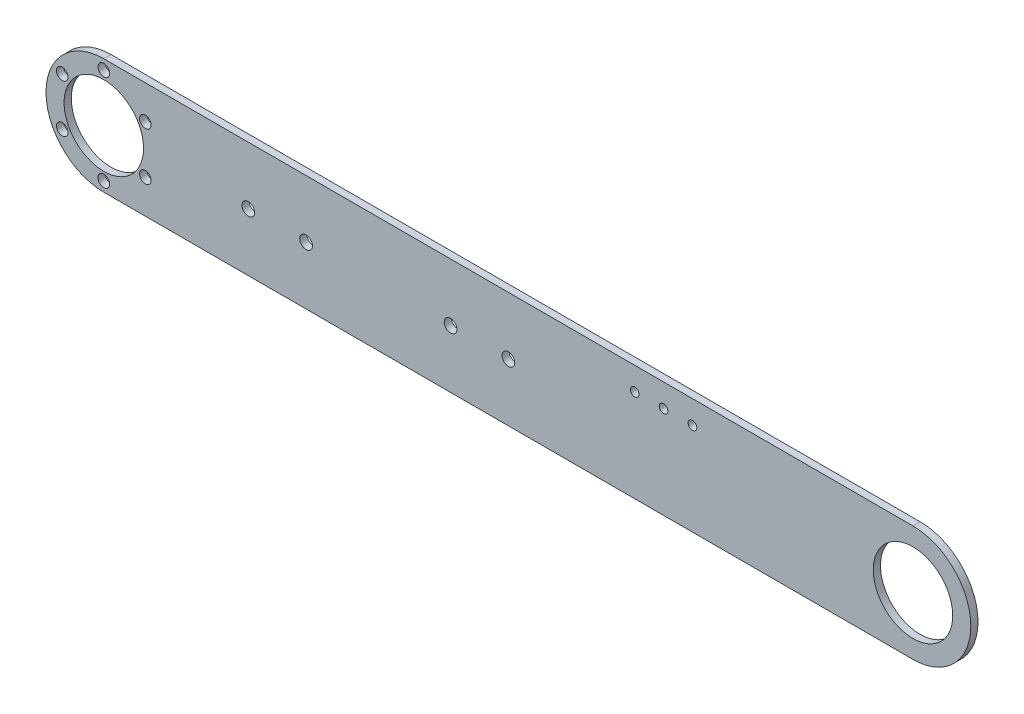
ISO-10303-21;
HEADER;
FILE_DESCRIPTION(('STEP AP214'),'2;1');
FILE_NAME('part.step','',(''),(''),'','','');
FILE_SCHEMA(('AUTOMOTIVE_DESIGN { 1 0 10303 214 1 1 1 1 }'));
ENDSEC;
DATA;
#1=APPLICATION_CONTEXT('core data for automotive mechanical design processes');
#2=APPLICATION_PROTOCOL_DEFINITION('international standard','automotive_design',2000,#1);
#3=PRODUCT_CONTEXT('',#1,'mechanical');
#4=PRODUCT('Part','Part','',(#3));
#5=PRODUCT_RELATED_PRODUCT_CATEGORY('part','',(#4));
#6=PRODUCT_DEFINITION_FORMATION('','',#4);
#7=PRODUCT_DEFINITION_CONTEXT('part definition',#1,'design');
#8=PRODUCT_DEFINITION('design','',#6,#7);
#9=PRODUCT_DEFINITION_SHAPE('','',#8);
#10=(LENGTH_UNIT() NAMED_UNIT(*) SI_UNIT(.MILLI.,.METRE.));
#11=(NAMED_UNIT(*) PLANE_ANGLE_UNIT() SI_UNIT($,.RADIAN.));
#12=(NAMED_UNIT(*) SI_UNIT($,.STERADIAN.) SOLID_ANGLE_UNIT());
#13=UNCERTAINTY_MEASURE_WITH_UNIT(LENGTH_MEASURE(1.E-05),#10,'distance_accuracy_value','');
#14=(GEOMETRIC_REPRESENTATION_CONTEXT(3) GLOBAL_UNCERTAINTY_ASSIGNED_CONTEXT((#13)) GLOBAL_UNIT_ASSIGNED_CONTEXT((#10,
#11,#12)) REPRESENTATION_CONTEXT('',''));
#15=CARTESIAN_POINT('',(0.,0.,0.));
#16=DIRECTION('',(0.,0.,1.));
#17=DIRECTION('',(1.,0.,0.));
#18=AXIS2_PLACEMENT_3D('',#15,#16,#17);
#19=CARTESIAN_POINT('',(0.,25.4,3.175));
#20=DIRECTION('',(0.,0.,-1.));
#21=DIRECTION('',(-1.,0.,0.));
#22=AXIS2_PLACEMENT_3D('',#19,#20,#21);
#23=CYLINDRICAL_SURFACE('',#22,25.4);
#24=CARTESIAN_POINT('',(0.,25.4,0.));
#25=DIRECTION('',(0.,0.,1.));
#26=DIRECTION('',(1.,0.,0.));
#27=AXIS2_PLACEMENT_3D('',#24,#25,#26);
#28=CIRCLE('',#27,25.4);
#29=CARTESIAN_POINT('',(0.,50.8,0.));
#30=VERTEX_POINT('',#29);
#31=CARTESIAN_POINT('',(0.,0.,0.));
#32=VERTEX_POINT('',#31);
#33=EDGE_CURVE('E98',#30,#32,#28,.T.);
#34=ORIENTED_EDGE('',*,*,#33,.T.);
#35=DIRECTION('',(0.,0.,-1.));
#36=VECTOR('',#35,1.);
#37=CARTESIAN_POINT('',(0.,0.,3.175));
#38=LINE('',#37,#36);
#39=CARTESIAN_POINT('',(0.,0.,3.175));
#40=VERTEX_POINT('',#39);
#41=EDGE_CURVE('E11',#40,#32,#38,.T.);
#42=ORIENTED_EDGE('',*,*,#41,.F.);
#43=CARTESIAN_POINT('',(0.,25.4,3.175));
#44=DIRECTION('',(0.,0.,1.));
#45=DIRECTION('',(1.,0.,0.));
#46=AXIS2_PLACEMENT_3D('',#43,#44,#45);
#47=CIRCLE('',#46,25.4);
#48=CARTESIAN_POINT('',(0.,50.8,3.175));
#49=VERTEX_POINT('',#48);
#50=EDGE_CURVE('E86',#49,#40,#47,.T.);
#51=ORIENTED_EDGE('',*,*,#50,.F.);
#52=DIRECTION('',(0.,0.,-1.));
#53=VECTOR('',#52,1.);
#54=CARTESIAN_POINT('',(0.,50.8,3.175));
#55=LINE('',#54,#53);
#56=EDGE_CURVE('E94',#49,#30,#55,.T.);
#57=ORIENTED_EDGE('',*,*,#56,.T.);
#58=EDGE_LOOP('',(#34,#42,#51,#57));
#59=FACE_BOUND('',#58,.T.);
#60=ADVANCED_FACE('F35',(#59),#23,.T.);
#61=CARTESIAN_POINT('',(0.,0.,3.175));
#62=DIRECTION('',(0.,1.,0.));
#63=DIRECTION('',(0.,0.,1.));
#64=AXIS2_PLACEMENT_3D('',#61,#62,#63);
#65=PLANE('',#64);
#66=DIRECTION('',(1.,0.,0.));
#67=VECTOR('',#66,1.);
#68=CARTESIAN_POINT('',(0.,0.,0.));
#69=LINE('',#68,#67);
#70=CARTESIAN_POINT('',(355.6,0.,0.));
#71=VERTEX_POINT('',#70);
#72=EDGE_CURVE('E90',#32,#71,#69,.T.);
#73=ORIENTED_EDGE('',*,*,#72,.T.);
#74=DIRECTION('',(0.,0.,-1.));
#75=VECTOR('',#74,1.);
#76=CARTESIAN_POINT('',(355.6,0.,3.175));
#77=LINE('',#76,#75);
#78=CARTESIAN_POINT('',(355.6,0.,3.175));
#79=VERTEX_POINT('',#78);
#80=EDGE_CURVE('E43',#79,#71,#77,.T.);
#81=ORIENTED_EDGE('',*,*,#80,.F.);
#82=DIRECTION('',(1.,0.,0.));
#83=VECTOR('',#82,1.);
#84=CARTESIAN_POINT('',(0.,0.,3.175));
#85=LINE('',#84,#83);
#86=EDGE_CURVE('E81',#40,#79,#85,.T.);
#87=ORIENTED_EDGE('',*,*,#86,.F.);
#88=ORIENTED_EDGE('',*,*,#41,.T.);
#89=EDGE_LOOP('',(#73,#81,#87,#88));
#90=FACE_BOUND('',#89,.T.);
#91=ADVANCED_FACE('F89',(#90),#65,.F.);
#92=CARTESIAN_POINT('',(355.6,25.4,3.175));
#93=DIRECTION('',(0.,0.,-1.));
#94=DIRECTION('',(-1.,0.,0.));
#95=AXIS2_PLACEMENT_3D('',#92,#93,#94);
#96=CYLINDRICAL_SURFACE('',#95,25.4);
#97=CARTESIAN_POINT('',(355.6,25.4,0.));
#98=DIRECTION('',(0.,0.,1.));
#99=DIRECTION('',(1.,0.,0.));
#100=AXIS2_PLACEMENT_3D('',#97,#98,#99);
#101=CIRCLE('',#100,25.4);
#102=CARTESIAN_POINT('',(355.6,50.8,0.));
#103=VERTEX_POINT('',#102);
#104=EDGE_CURVE('E68',#71,#103,#101,.T.);
#105=ORIENTED_EDGE('',*,*,#104,.T.);
#106=DIRECTION('',(0.,0.,-1.));
#107=VECTOR('',#106,1.);
#108=CARTESIAN_POINT('',(355.6,50.8,3.175));
#109=LINE('',#108,#107);
#110=CARTESIAN_POINT('',(355.6,50.8,3.175));
#111=VERTEX_POINT('',#110);
#112=EDGE_CURVE('E91',#111,#103,#109,.T.);
#113=ORIENTED_EDGE('',*,*,#112,.F.);
#114=CARTESIAN_POINT('',(355.6,25.4,3.175));
#115=DIRECTION('',(0.,0.,1.));
#116=DIRECTION('',(1.,0.,0.));
#117=AXIS2_PLACEMENT_3D('',#114,#115,#116);
#118=CIRCLE('',#117,25.4);
#119=EDGE_CURVE('E84',#79,#111,#118,.T.);
#120=ORIENTED_EDGE('',*,*,#119,.F.);
#121=ORIENTED_EDGE('',*,*,#80,.T.);
#122=EDGE_LOOP('',(#105,#113,#120,#121));
#123=FACE_BOUND('',#122,.T.);
#124=ADVANCED_FACE('F92',(#123),#96,.T.);
#125=CARTESIAN_POINT('',(0.,50.8,3.175));
#126=DIRECTION('',(0.,-1.,0.));
#127=DIRECTION('',(0.,0.,-1.));
#128=AXIS2_PLACEMENT_3D('',#125,#126,#127);
#129=PLANE('',#128);
#130=DIRECTION('',(-1.,0.,0.));
#131=VECTOR('',#130,1.);
#132=CARTESIAN_POINT('',(0.,50.8,0.));
#133=LINE('',#132,#131);
#134=EDGE_CURVE('E74',#103,#30,#133,.T.);
#135=ORIENTED_EDGE('',*,*,#134,.T.);
#136=ORIENTED_EDGE('',*,*,#56,.F.);
#137=DIRECTION('',(-1.,0.,0.));
#138=VECTOR('',#137,1.);
#139=CARTESIAN_POINT('',(0.,50.8,3.175));
#140=LINE('',#139,#138);
#141=EDGE_CURVE('E51',#111,#49,#140,.T.);
#142=ORIENTED_EDGE('',*,*,#141,.F.);
#143=ORIENTED_EDGE('',*,*,#112,.T.);
#144=EDGE_LOOP('',(#135,#136,#142,#143));
#145=FACE_BOUND('',#144,.T.);
#146=ADVANCED_FACE('F106',(#145),#129,.F.);
#147=CARTESIAN_POINT('',(0.,25.4,3.175));
#148=DIRECTION('',(0.,0.,1.));
#149=DIRECTION('',(1.,0.,0.));
#150=AXIS2_PLACEMENT_3D('',#147,#148,#149);
#151=PLANE('',#150);
#152=CARTESIAN_POINT('',(258.687715097587,40.64,3.175));
#153=DIRECTION('',(0.,0.,1.));
#154=DIRECTION('',(1.,0.,0.));
#155=AXIS2_PLACEMENT_3D('',#152,#153,#154);
#156=CIRCLE('',#155,1.90499999999999);
#157=CARTESIAN_POINT('',(260.592715097587,40.64,3.175));
#158=VERTEX_POINT('',#157);
#159=EDGE_CURVE('E196',#158,#158,#156,.T.);
#160=ORIENTED_EDGE('',*,*,#159,.F.);
#161=EDGE_LOOP('',(#160));
#162=FACE_BOUND('',#161,.T.);
#163=CARTESIAN_POINT('',(245.987715097587,40.64,3.175));
#164=DIRECTION('',(0.,0.,1.));
#165=DIRECTION('',(1.,0.,0.));
#166=AXIS2_PLACEMENT_3D('',#163,#164,#165);
#167=CIRCLE('',#166,1.90499999999999);
#168=CARTESIAN_POINT('',(247.892715097587,40.64,3.175));
#169=VERTEX_POINT('',#168);
#170=EDGE_CURVE('E190',#169,#169,#167,.T.);
#171=ORIENTED_EDGE('',*,*,#170,.F.);
#172=EDGE_LOOP('',(#171));
#173=FACE_BOUND('',#172,.T.);
#174=CARTESIAN_POINT('',(233.287715097587,40.64,3.175));
#175=DIRECTION('',(0.,0.,1.));
#176=DIRECTION('',(1.,0.,0.));
#177=AXIS2_PLACEMENT_3D('',#174,#175,#176);
#178=CIRCLE('',#177,1.90499999999999);
#179=CARTESIAN_POINT('',(235.192715097587,40.64,3.175));
#180=VERTEX_POINT('',#179);
#181=EDGE_CURVE('E184',#180,#180,#178,.T.);
#182=ORIENTED_EDGE('',*,*,#181,.F.);
#183=EDGE_LOOP('',(#182));
#184=FACE_BOUND('',#183,.T.);
#185=CARTESIAN_POINT('',(63.5000000000007,25.4000000000075,3.175));
#186=DIRECTION('',(0.,0.,1.));
#187=DIRECTION('',(1.,0.,0.));
#188=AXIS2_PLACEMENT_3D('',#185,#186,#187);
#189=CIRCLE('',#188,2.79400000000002);
#190=CARTESIAN_POINT('',(66.2940000000007,25.4000000000075,3.175));
#191=VERTEX_POINT('',#190);
#192=EDGE_CURVE('E179',#191,#191,#189,.T.);
#193=ORIENTED_EDGE('',*,*,#192,.F.);
#194=EDGE_LOOP('',(#193));
#195=FACE_BOUND('',#194,.T.);
#196=CARTESIAN_POINT('',(88.9000000000007,25.4000000000075,3.175));
#197=DIRECTION('',(0.,0.,1.));
#198=DIRECTION('',(1.,0.,0.));
#199=AXIS2_PLACEMENT_3D('',#196,#197,#198);
#200=CIRCLE('',#199,2.79399999999998);
#201=CARTESIAN_POINT('',(91.6940000000007,25.4000000000075,3.175));
#202=VERTEX_POINT('',#201);
#203=EDGE_CURVE('E173',#202,#202,#200,.T.);
#204=ORIENTED_EDGE('',*,*,#203,.F.);
#205=EDGE_LOOP('',(#204));
#206=FACE_BOUND('',#205,.T.);
#207=CARTESIAN_POINT('',(152.400000000001,25.4000000000075,3.175));
#208=DIRECTION('',(0.,0.,1.));
#209=DIRECTION('',(1.,0.,0.));
#210=AXIS2_PLACEMENT_3D('',#207,#208,#209);
#211=CIRCLE('',#210,2.79399999999998);
#212=CARTESIAN_POINT('',(155.194000000001,25.4000000000075,3.175));
#213=VERTEX_POINT('',#212);
#214=EDGE_CURVE('E167',#213,#213,#211,.T.);
#215=ORIENTED_EDGE('',*,*,#214,.F.);
#216=EDGE_LOOP('',(#215));
#217=FACE_BOUND('',#216,.T.);
#218=CARTESIAN_POINT('',(177.800000000001,25.4000000000075,3.175));
#219=DIRECTION('',(0.,0.,1.));
#220=DIRECTION('',(1.,0.,0.));
#221=AXIS2_PLACEMENT_3D('',#218,#219,#220);
#222=CIRCLE('',#221,2.79399999999999);
#223=CARTESIAN_POINT('',(180.594000000001,25.4000000000075,3.175));
#224=VERTEX_POINT('',#223);
#225=EDGE_CURVE('E160',#224,#224,#222,.T.);
#226=ORIENTED_EDGE('',*,*,#225,.F.);
#227=EDGE_LOOP('',(#226));
#228=FACE_BOUND('',#227,.T.);
#229=CARTESIAN_POINT('',(18.2575475625839,35.9410000000005,3.175));
#230=DIRECTION('',(0.,0.,1.));
#231=DIRECTION('',(1.,0.,0.));
#232=AXIS2_PLACEMENT_3D('',#229,#230,#231);
#233=CIRCLE('',#232,2.55269999999999);
#234=CARTESIAN_POINT('',(20.8102475625838,35.9410000000005,3.175));
#235=VERTEX_POINT('',#234);
#236=EDGE_CURVE('E156',#235,#235,#233,.T.);
#237=ORIENTED_EDGE('',*,*,#236,.F.);
#238=EDGE_LOOP('',(#237));
#239=FACE_BOUND('',#238,.T.);
#240=CARTESIAN_POINT('',(18.2575475625844,14.8590000000004,3.175));
#241=DIRECTION('',(0.,0.,1.));
#242=DIRECTION('',(1.,0.,0.));
#243=AXIS2_PLACEMENT_3D('',#240,#241,#242);
#244=CIRCLE('',#243,2.55269999999999);
#245=CARTESIAN_POINT('',(20.8102475625844,14.8590000000004,3.175));
#246=VERTEX_POINT('',#245);
#247=EDGE_CURVE('E150',#246,#246,#244,.T.);
#248=ORIENTED_EDGE('',*,*,#247,.F.);
#249=EDGE_LOOP('',(#248));
#250=FACE_BOUND('',#249,.T.);
#251=CARTESIAN_POINT('',(1.04083093572472E-12,4.318,3.175));
#252=DIRECTION('',(0.,0.,1.));
#253=DIRECTION('',(1.,0.,0.));
#254=AXIS2_PLACEMENT_3D('',#251,#252,#253);
#255=CIRCLE('',#254,2.55269999999999);
#256=CARTESIAN_POINT('',(2.55270000000103,4.318,3.175));
#257=VERTEX_POINT('',#256);
#258=EDGE_CURVE('E144',#257,#257,#255,.T.);
#259=ORIENTED_EDGE('',*,*,#258,.F.);
#260=EDGE_LOOP('',(#259));
#261=FACE_BOUND('',#260,.T.);
#262=CARTESIAN_POINT('',(-18.2575475625827,14.8589999999997,3.175));
#263=DIRECTION('',(0.,0.,1.));
#264=DIRECTION('',(1.,0.,0.));
#265=AXIS2_PLACEMENT_3D('',#262,#263,#264);
#266=CIRCLE('',#265,2.55269999999999);
#267=CARTESIAN_POINT('',(-15.7048475625828,14.8589999999997,3.175));
#268=VERTEX_POINT('',#267);
#269=EDGE_CURVE('E138',#268,#268,#266,.T.);
#270=ORIENTED_EDGE('',*,*,#269,.F.);
#271=EDGE_LOOP('',(#270));
#272=FACE_BOUND('',#271,.T.);
#273=CARTESIAN_POINT('',(-18.2575475625831,35.9409999999997,3.175));
#274=DIRECTION('',(0.,0.,1.));
#275=DIRECTION('',(1.,0.,0.));
#276=AXIS2_PLACEMENT_3D('',#273,#274,#275);
#277=CIRCLE('',#276,2.55269999999999);
#278=CARTESIAN_POINT('',(-15.7048475625831,35.9409999999997,3.175));
#279=VERTEX_POINT('',#278);
#280=EDGE_CURVE('E132',#279,#279,#277,.T.);
#281=ORIENTED_EDGE('',*,*,#280,.F.);
#282=EDGE_LOOP('',(#281));
#283=FACE_BOUND('',#282,.T.);
#284=CARTESIAN_POINT('',(0.,46.482,3.175));
#285=DIRECTION('',(0.,0.,1.));
#286=DIRECTION('',(1.,0.,0.));
#287=AXIS2_PLACEMENT_3D('',#284,#285,#286);
#288=CIRCLE('',#287,2.55269999999999);
#289=CARTESIAN_POINT('',(2.55269999999999,46.482,3.175));
#290=VERTEX_POINT('',#289);
#291=EDGE_CURVE('E126',#290,#290,#288,.T.);
#292=ORIENTED_EDGE('',*,*,#291,.F.);
#293=EDGE_LOOP('',(#292));
#294=FACE_BOUND('',#293,.T.);
#295=CARTESIAN_POINT('',(0.,25.4,3.175));
#296=DIRECTION('',(0.,0.,1.));
#297=DIRECTION('',(1.,0.,0.));
#298=AXIS2_PLACEMENT_3D('',#295,#296,#297);
#299=CIRCLE('',#298,17.4625);
#300=CARTESIAN_POINT('',(17.4625,25.4,3.175));
#301=VERTEX_POINT('',#300);
#302=EDGE_CURVE('E119',#301,#301,#299,.T.);
#303=ORIENTED_EDGE('',*,*,#302,.F.);
#304=EDGE_LOOP('',(#303));
#305=FACE_BOUND('',#304,.T.);
#306=CARTESIAN_POINT('',(355.6,25.4,3.175));
#307=DIRECTION('',(0.,0.,1.));
#308=DIRECTION('',(1.,0.,0.));
#309=AXIS2_PLACEMENT_3D('',#306,#307,#308);
#310=CIRCLE('',#309,17.4625);
#311=CARTESIAN_POINT('',(373.0625,25.4,3.175));
#312=VERTEX_POINT('',#311);
#313=EDGE_CURVE('E112',#312,#312,#310,.T.);
#314=ORIENTED_EDGE('',*,*,#313,.F.);
#315=EDGE_LOOP('',(#314));
#316=FACE_BOUND('',#315,.T.);
#317=ORIENTED_EDGE('',*,*,#50,.T.);
#318=ORIENTED_EDGE('',*,*,#86,.T.);
#319=ORIENTED_EDGE('',*,*,#119,.T.);
#320=ORIENTED_EDGE('',*,*,#141,.T.);
#321=EDGE_LOOP('',(#317,#318,#319,#320));
#322=FACE_BOUND('',#321,.T.);
#323=ADVANCED_FACE('F82',(#162,#173,#184,#195,#206,#217,#228,#239,#250,#261,#272,#283,#294,#305,
#316,#322),#151,.T.);
#324=CARTESIAN_POINT('',(0.,25.4,0.));
#325=DIRECTION('',(0.,0.,1.));
#326=DIRECTION('',(1.,0.,0.));
#327=AXIS2_PLACEMENT_3D('',#324,#325,#326);
#328=PLANE('',#327);
#329=CARTESIAN_POINT('',(258.687715097587,40.64,0.));
#330=DIRECTION('',(0.,0.,1.));
#331=DIRECTION('',(1.,0.,0.));
#332=AXIS2_PLACEMENT_3D('',#329,#330,#331);
#333=CIRCLE('',#332,1.90499999999999);
#334=CARTESIAN_POINT('',(260.592715097587,40.64,0.));
#335=VERTEX_POINT('',#334);
#336=EDGE_CURVE('E164',#335,#335,#333,.T.);
#337=ORIENTED_EDGE('',*,*,#336,.T.);
#338=EDGE_LOOP('',(#337));
#339=FACE_BOUND('',#338,.T.);
#340=CARTESIAN_POINT('',(245.987715097587,40.64,0.));
#341=DIRECTION('',(0.,0.,1.));
#342=DIRECTION('',(1.,0.,0.));
#343=AXIS2_PLACEMENT_3D('',#340,#341,#342);
#344=CIRCLE('',#343,1.90499999999999);
#345=CARTESIAN_POINT('',(247.892715097587,40.64,0.));
#346=VERTEX_POINT('',#345);
#347=EDGE_CURVE('E193',#346,#346,#344,.T.);
#348=ORIENTED_EDGE('',*,*,#347,.T.);
#349=EDGE_LOOP('',(#348));
#350=FACE_BOUND('',#349,.T.);
#351=CARTESIAN_POINT('',(233.287715097587,40.64,0.));
#352=DIRECTION('',(0.,0.,1.));
#353=DIRECTION('',(1.,0.,0.));
#354=AXIS2_PLACEMENT_3D('',#351,#352,#353);
#355=CIRCLE('',#354,1.90499999999999);
#356=CARTESIAN_POINT('',(235.192715097587,40.64,0.));
#357=VERTEX_POINT('',#356);
#358=EDGE_CURVE('E187',#357,#357,#355,.T.);
#359=ORIENTED_EDGE('',*,*,#358,.T.);
#360=EDGE_LOOP('',(#359));
#361=FACE_BOUND('',#360,.T.);
#362=CARTESIAN_POINT('',(63.5000000000007,25.4000000000075,0.));
#363=DIRECTION('',(0.,0.,1.));
#364=DIRECTION('',(1.,0.,0.));
#365=AXIS2_PLACEMENT_3D('',#362,#363,#364);
#366=CIRCLE('',#365,2.79400000000002);
#367=CARTESIAN_POINT('',(66.2940000000007,25.4000000000075,0.));
#368=VERTEX_POINT('',#367);
#369=EDGE_CURVE('E159',#368,#368,#366,.T.);
#370=ORIENTED_EDGE('',*,*,#369,.T.);
#371=EDGE_LOOP('',(#370));
#372=FACE_BOUND('',#371,.T.);
#373=CARTESIAN_POINT('',(88.9000000000007,25.4000000000075,0.));
#374=DIRECTION('',(0.,0.,1.));
#375=DIRECTION('',(1.,0.,0.));
#376=AXIS2_PLACEMENT_3D('',#373,#374,#375);
#377=CIRCLE('',#376,2.79399999999998);
#378=CARTESIAN_POINT('',(91.6940000000007,25.4000000000075,0.));
#379=VERTEX_POINT('',#378);
#380=EDGE_CURVE('E176',#379,#379,#377,.T.);
#381=ORIENTED_EDGE('',*,*,#380,.T.);
#382=EDGE_LOOP('',(#381));
#383=FACE_BOUND('',#382,.T.);
#384=CARTESIAN_POINT('',(152.400000000001,25.4000000000075,0.));
#385=DIRECTION('',(0.,0.,1.));
#386=DIRECTION('',(1.,0.,0.));
#387=AXIS2_PLACEMENT_3D('',#384,#385,#386);
#388=CIRCLE('',#387,2.79399999999998);
#389=CARTESIAN_POINT('',(155.194000000001,25.4000000000075,0.));
#390=VERTEX_POINT('',#389);
#391=EDGE_CURVE('E170',#390,#390,#388,.T.);
#392=ORIENTED_EDGE('',*,*,#391,.T.);
#393=EDGE_LOOP('',(#392));
#394=FACE_BOUND('',#393,.T.);
#395=CARTESIAN_POINT('',(177.800000000001,25.4000000000075,0.));
#396=DIRECTION('',(0.,0.,1.));
#397=DIRECTION('',(1.,0.,0.));
#398=AXIS2_PLACEMENT_3D('',#395,#396,#397);
#399=CIRCLE('',#398,2.79399999999999);
#400=CARTESIAN_POINT('',(180.594000000001,25.4000000000075,0.));
#401=VERTEX_POINT('',#400);
#402=EDGE_CURVE('E163',#401,#401,#399,.T.);
#403=ORIENTED_EDGE('',*,*,#402,.T.);
#404=EDGE_LOOP('',(#403));
#405=FACE_BOUND('',#404,.T.);
#406=CARTESIAN_POINT('',(18.2575475625839,35.9410000000005,0.));
#407=DIRECTION('',(0.,0.,1.));
#408=DIRECTION('',(1.,0.,0.));
#409=AXIS2_PLACEMENT_3D('',#406,#407,#408);
#410=CIRCLE('',#409,2.5527);
#411=CARTESIAN_POINT('',(20.8102475625839,35.9410000000005,0.));
#412=VERTEX_POINT('',#411);
#413=EDGE_CURVE('E153',#412,#412,#410,.T.);
#414=ORIENTED_EDGE('',*,*,#413,.T.);
#415=EDGE_LOOP('',(#414));
#416=FACE_BOUND('',#415,.T.);
#417=CARTESIAN_POINT('',(18.2575475625844,14.8590000000004,0.));
#418=DIRECTION('',(0.,0.,1.));
#419=DIRECTION('',(1.,0.,0.));
#420=AXIS2_PLACEMENT_3D('',#417,#418,#419);
#421=CIRCLE('',#420,2.5527);
#422=CARTESIAN_POINT('',(20.8102475625844,14.8590000000004,0.));
#423=VERTEX_POINT('',#422);
#424=EDGE_CURVE('E147',#423,#423,#421,.T.);
#425=ORIENTED_EDGE('',*,*,#424,.T.);
#426=EDGE_LOOP('',(#425));
#427=FACE_BOUND('',#426,.T.);
#428=CARTESIAN_POINT('',(1.04083093572472E-12,4.318,0.));
#429=DIRECTION('',(0.,0.,1.));
#430=DIRECTION('',(1.,0.,0.));
#431=AXIS2_PLACEMENT_3D('',#428,#429,#430);
#432=CIRCLE('',#431,2.5527);
#433=CARTESIAN_POINT('',(2.55270000000104,4.318,0.));
#434=VERTEX_POINT('',#433);
#435=EDGE_CURVE('E141',#434,#434,#432,.T.);
#436=ORIENTED_EDGE('',*,*,#435,.T.);
#437=EDGE_LOOP('',(#436));
#438=FACE_BOUND('',#437,.T.);
#439=CARTESIAN_POINT('',(-18.2575475625827,14.8589999999997,0.));
#440=DIRECTION('',(0.,0.,1.));
#441=DIRECTION('',(1.,0.,0.));
#442=AXIS2_PLACEMENT_3D('',#439,#440,#441);
#443=CIRCLE('',#442,2.5527);
#444=CARTESIAN_POINT('',(-15.7048475625827,14.8589999999997,0.));
#445=VERTEX_POINT('',#444);
#446=EDGE_CURVE('E135',#445,#445,#443,.T.);
#447=ORIENTED_EDGE('',*,*,#446,.T.);
#448=EDGE_LOOP('',(#447));
#449=FACE_BOUND('',#448,.T.);
#450=CARTESIAN_POINT('',(-18.2575475625831,35.9409999999997,0.));
#451=DIRECTION('',(0.,0.,1.));
#452=DIRECTION('',(1.,0.,0.));
#453=AXIS2_PLACEMENT_3D('',#450,#451,#452);
#454=CIRCLE('',#453,2.5527);
#455=CARTESIAN_POINT('',(-15.7048475625831,35.9409999999997,0.));
#456=VERTEX_POINT('',#455);
#457=EDGE_CURVE('E129',#456,#456,#454,.T.);
#458=ORIENTED_EDGE('',*,*,#457,.T.);
#459=EDGE_LOOP('',(#458));
#460=FACE_BOUND('',#459,.T.);
#461=CARTESIAN_POINT('',(0.,46.482,0.));
#462=DIRECTION('',(0.,0.,1.));
#463=DIRECTION('',(1.,0.,0.));
#464=AXIS2_PLACEMENT_3D('',#461,#462,#463);
#465=CIRCLE('',#464,2.5527);
#466=CARTESIAN_POINT('',(2.5527,46.482,0.));
#467=VERTEX_POINT('',#466);
#468=EDGE_CURVE('E116',#467,#467,#465,.T.);
#469=ORIENTED_EDGE('',*,*,#468,.T.);
#470=EDGE_LOOP('',(#469));
#471=FACE_BOUND('',#470,.T.);
#472=CARTESIAN_POINT('',(0.,25.4,0.));
#473=DIRECTION('',(0.,0.,1.));
#474=DIRECTION('',(1.,0.,0.));
#475=AXIS2_PLACEMENT_3D('',#472,#473,#474);
#476=CIRCLE('',#475,17.4625);
#477=CARTESIAN_POINT('',(17.4625,25.4,0.));
#478=VERTEX_POINT('',#477);
#479=EDGE_CURVE('E101',#478,#478,#476,.T.);
#480=ORIENTED_EDGE('',*,*,#479,.T.);
#481=EDGE_LOOP('',(#480));
#482=FACE_BOUND('',#481,.T.);
#483=CARTESIAN_POINT('',(355.6,25.4,0.));
#484=DIRECTION('',(0.,0.,1.));
#485=DIRECTION('',(1.,0.,0.));
#486=AXIS2_PLACEMENT_3D('',#483,#484,#485);
#487=CIRCLE('',#486,17.4625);
#488=CARTESIAN_POINT('',(373.0625,25.4,0.));
#489=VERTEX_POINT('',#488);
#490=EDGE_CURVE('E115',#489,#489,#487,.T.);
#491=ORIENTED_EDGE('',*,*,#490,.T.);
#492=EDGE_LOOP('',(#491));
#493=FACE_BOUND('',#492,.T.);
#494=ORIENTED_EDGE('',*,*,#33,.F.);
#495=ORIENTED_EDGE('',*,*,#134,.F.);
#496=ORIENTED_EDGE('',*,*,#104,.F.);
#497=ORIENTED_EDGE('',*,*,#72,.F.);
#498=EDGE_LOOP('',(#494,#495,#496,#497));
#499=FACE_BOUND('',#498,.T.);
#500=ADVANCED_FACE('F109',(#339,#350,#361,#372,#383,#394,#405,#416,#427,#438,#449,#460,#471,
#482,#493,#499),#328,.F.);
#501=CARTESIAN_POINT('',(355.6,25.4,0.));
#502=DIRECTION('',(0.,0.,1.));
#503=DIRECTION('',(1.,0.,0.));
#504=AXIS2_PLACEMENT_3D('',#501,#502,#503);
#505=CYLINDRICAL_SURFACE('',#504,17.4625);
#506=ORIENTED_EDGE('',*,*,#490,.F.);
#507=EDGE_LOOP('',(#506));
#508=FACE_BOUND('',#507,.T.);
#509=ORIENTED_EDGE('',*,*,#313,.T.);
#510=EDGE_LOOP('',(#509));
#511=FACE_BOUND('',#510,.T.);
#512=ADVANCED_FACE('F242',(#508,#511),#505,.F.);
#513=CARTESIAN_POINT('',(0.,25.4,0.));
#514=DIRECTION('',(0.,0.,1.));
#515=DIRECTION('',(1.,0.,0.));
#516=AXIS2_PLACEMENT_3D('',#513,#514,#515);
#517=CYLINDRICAL_SURFACE('',#516,17.4625);
#518=ORIENTED_EDGE('',*,*,#479,.F.);
#519=EDGE_LOOP('',(#518));
#520=FACE_BOUND('',#519,.T.);
#521=ORIENTED_EDGE('',*,*,#302,.T.);
#522=EDGE_LOOP('',(#521));
#523=FACE_BOUND('',#522,.T.);
#524=ADVANCED_FACE('F244',(#520,#523),#517,.F.);
#525=CARTESIAN_POINT('',(0.,46.482,3.175));
#526=DIRECTION('',(0.,0.,1.));
#527=DIRECTION('',(1.,0.,0.));
#528=AXIS2_PLACEMENT_3D('',#525,#526,#527);
#529=CYLINDRICAL_SURFACE('',#528,2.55269999999999);
#530=ORIENTED_EDGE('',*,*,#468,.F.);
#531=EDGE_LOOP('',(#530));
#532=FACE_BOUND('',#531,.T.);
#533=ORIENTED_EDGE('',*,*,#291,.T.);
#534=EDGE_LOOP('',(#533));
#535=FACE_BOUND('',#534,.T.);
#536=ADVANCED_FACE('F251',(#532,#535),#529,.F.);
#537=CARTESIAN_POINT('',(-18.2575475625831,35.9409999999997,3.175));
#538=DIRECTION('',(0.,0.,1.));
#539=DIRECTION('',(1.,0.,0.));
#540=AXIS2_PLACEMENT_3D('',#537,#538,#539);
#541=CYLINDRICAL_SURFACE('',#540,2.55269999999999);
#542=ORIENTED_EDGE('',*,*,#457,.F.);
#543=EDGE_LOOP('',(#542));
#544=FACE_BOUND('',#543,.T.);
#545=ORIENTED_EDGE('',*,*,#280,.T.);
#546=EDGE_LOOP('',(#545));
#547=FACE_BOUND('',#546,.T.);
#548=ADVANCED_FACE('F346',(#544,#547),#541,.F.);
#549=CARTESIAN_POINT('',(-18.2575475625827,14.8589999999997,3.175));
#550=DIRECTION('',(0.,0.,1.));
#551=DIRECTION('',(1.,0.,0.));
#552=AXIS2_PLACEMENT_3D('',#549,#550,#551);
#553=CYLINDRICAL_SURFACE('',#552,2.55269999999999);
#554=ORIENTED_EDGE('',*,*,#446,.F.);
#555=EDGE_LOOP('',(#554));
#556=FACE_BOUND('',#555,.T.);
#557=ORIENTED_EDGE('',*,*,#269,.T.);
#558=EDGE_LOOP('',(#557));
#559=FACE_BOUND('',#558,.T.);
#560=ADVANCED_FACE('F342',(#556,#559),#553,.F.);
#561=CARTESIAN_POINT('',(1.04083093572472E-12,4.318,3.175));
#562=DIRECTION('',(0.,0.,1.));
#563=DIRECTION('',(1.,0.,0.));
#564=AXIS2_PLACEMENT_3D('',#561,#562,#563);
#565=CYLINDRICAL_SURFACE('',#564,2.55269999999999);
#566=ORIENTED_EDGE('',*,*,#435,.F.);
#567=EDGE_LOOP('',(#566));
#568=FACE_BOUND('',#567,.T.);
#569=ORIENTED_EDGE('',*,*,#258,.T.);
#570=EDGE_LOOP('',(#569));
#571=FACE_BOUND('',#570,.T.);
#572=ADVANCED_FACE('F338',(#568,#571),#565,.F.);
#573=CARTESIAN_POINT('',(18.2575475625844,14.8590000000004,3.175));
#574=DIRECTION('',(0.,0.,1.));
#575=DIRECTION('',(1.,0.,0.));
#576=AXIS2_PLACEMENT_3D('',#573,#574,#575);
#577=CYLINDRICAL_SURFACE('',#576,2.55269999999999);
#578=ORIENTED_EDGE('',*,*,#424,.F.);
#579=EDGE_LOOP('',(#578));
#580=FACE_BOUND('',#579,.T.);
#581=ORIENTED_EDGE('',*,*,#247,.T.);
#582=EDGE_LOOP('',(#581));
#583=FACE_BOUND('',#582,.T.);
#584=ADVANCED_FACE('F334',(#580,#583),#577,.F.);
#585=CARTESIAN_POINT('',(18.2575475625839,35.9410000000005,3.175));
#586=DIRECTION('',(0.,0.,1.));
#587=DIRECTION('',(1.,0.,0.));
#588=AXIS2_PLACEMENT_3D('',#585,#586,#587);
#589=CYLINDRICAL_SURFACE('',#588,2.55269999999999);
#590=ORIENTED_EDGE('',*,*,#413,.F.);
#591=EDGE_LOOP('',(#590));
#592=FACE_BOUND('',#591,.T.);
#593=ORIENTED_EDGE('',*,*,#236,.T.);
#594=EDGE_LOOP('',(#593));
#595=FACE_BOUND('',#594,.T.);
#596=ADVANCED_FACE('F330',(#592,#595),#589,.F.);
#597=CARTESIAN_POINT('',(177.800000000001,25.4000000000075,0.));
#598=DIRECTION('',(0.,0.,1.));
#599=DIRECTION('',(1.,0.,0.));
#600=AXIS2_PLACEMENT_3D('',#597,#598,#599);
#601=CYLINDRICAL_SURFACE('',#600,2.79399999999999);
#602=ORIENTED_EDGE('',*,*,#402,.F.);
#603=EDGE_LOOP('',(#602));
#604=FACE_BOUND('',#603,.T.);
#605=ORIENTED_EDGE('',*,*,#225,.T.);
#606=EDGE_LOOP('',(#605));
#607=FACE_BOUND('',#606,.T.);
#608=ADVANCED_FACE('F326',(#604,#607),#601,.F.);
#609=CARTESIAN_POINT('',(152.400000000001,25.4000000000075,0.));
#610=DIRECTION('',(0.,0.,1.));
#611=DIRECTION('',(1.,0.,0.));
#612=AXIS2_PLACEMENT_3D('',#609,#610,#611);
#613=CYLINDRICAL_SURFACE('',#612,2.79399999999998);
#614=ORIENTED_EDGE('',*,*,#391,.F.);
#615=EDGE_LOOP('',(#614));
#616=FACE_BOUND('',#615,.T.);
#617=ORIENTED_EDGE('',*,*,#214,.T.);
#618=EDGE_LOOP('',(#617));
#619=FACE_BOUND('',#618,.T.);
#620=ADVANCED_FACE('F322',(#616,#619),#613,.F.);
#621=CARTESIAN_POINT('',(88.9000000000007,25.4000000000075,0.));
#622=DIRECTION('',(0.,0.,1.));
#623=DIRECTION('',(1.,0.,0.));
#624=AXIS2_PLACEMENT_3D('',#621,#622,#623);
#625=CYLINDRICAL_SURFACE('',#624,2.79399999999998);
#626=ORIENTED_EDGE('',*,*,#380,.F.);
#627=EDGE_LOOP('',(#626));
#628=FACE_BOUND('',#627,.T.);
#629=ORIENTED_EDGE('',*,*,#203,.T.);
#630=EDGE_LOOP('',(#629));
#631=FACE_BOUND('',#630,.T.);
#632=ADVANCED_FACE('F318',(#628,#631),#625,.F.);
#633=CARTESIAN_POINT('',(63.5000000000007,25.4000000000075,0.));
#634=DIRECTION('',(0.,0.,1.));
#635=DIRECTION('',(1.,0.,0.));
#636=AXIS2_PLACEMENT_3D('',#633,#634,#635);
#637=CYLINDRICAL_SURFACE('',#636,2.79400000000002);
#638=ORIENTED_EDGE('',*,*,#369,.F.);
#639=EDGE_LOOP('',(#638));
#640=FACE_BOUND('',#639,.T.);
#641=ORIENTED_EDGE('',*,*,#192,.T.);
#642=EDGE_LOOP('',(#641));
#643=FACE_BOUND('',#642,.T.);
#644=ADVANCED_FACE('F292',(#640,#643),#637,.F.);
#645=CARTESIAN_POINT('',(233.287715097587,40.64,0.));
#646=DIRECTION('',(0.,0.,1.));
#647=DIRECTION('',(1.,0.,0.));
#648=AXIS2_PLACEMENT_3D('',#645,#646,#647);
#649=CYLINDRICAL_SURFACE('',#648,1.90499999999999);
#650=ORIENTED_EDGE('',*,*,#358,.F.);
#651=EDGE_LOOP('',(#650));
#652=FACE_BOUND('',#651,.T.);
#653=ORIENTED_EDGE('',*,*,#181,.T.);
#654=EDGE_LOOP('',(#653));
#655=FACE_BOUND('',#654,.T.);
#656=ADVANCED_FACE('F287',(#652,#655),#649,.F.);
#657=CARTESIAN_POINT('',(245.987715097587,40.64,0.));
#658=DIRECTION('',(0.,0.,1.));
#659=DIRECTION('',(1.,0.,0.));
#660=AXIS2_PLACEMENT_3D('',#657,#658,#659);
#661=CYLINDRICAL_SURFACE('',#660,1.90499999999999);
#662=ORIENTED_EDGE('',*,*,#347,.F.);
#663=EDGE_LOOP('',(#662));
#664=FACE_BOUND('',#663,.T.);
#665=ORIENTED_EDGE('',*,*,#170,.T.);
#666=EDGE_LOOP('',(#665));
#667=FACE_BOUND('',#666,.T.);
#668=ADVANCED_FACE('F207',(#664,#667),#661,.F.);
#669=CARTESIAN_POINT('',(258.687715097587,40.64,0.));
#670=DIRECTION('',(0.,0.,1.));
#671=DIRECTION('',(1.,0.,0.));
#672=AXIS2_PLACEMENT_3D('',#669,#670,#671);
#673=CYLINDRICAL_SURFACE('',#672,1.90499999999999);
#674=ORIENTED_EDGE('',*,*,#336,.F.);
#675=EDGE_LOOP('',(#674));
#676=FACE_BOUND('',#675,.T.);
#677=ORIENTED_EDGE('',*,*,#159,.T.);
#678=EDGE_LOOP('',(#677));
#679=FACE_BOUND('',#678,.T.);
#680=ADVANCED_FACE('F204',(#676,#679),#673,.F.);
#681=CLOSED_SHELL('',(#60,#91,#124,#146,#323,#500,#512,#524,#536,#548,#560,#572,#584,#596,#608,
#620,#632,#644,#656,#668,#680));
#682=MANIFOLD_SOLID_BREP('B2',#681);
#683=ADVANCED_BREP_SHAPE_REPRESENTATION('',(#18,#682),#14);
#684=SHAPE_DEFINITION_REPRESENTATION(#9,#683);
ENDSEC;
END-ISO-10303-21;
